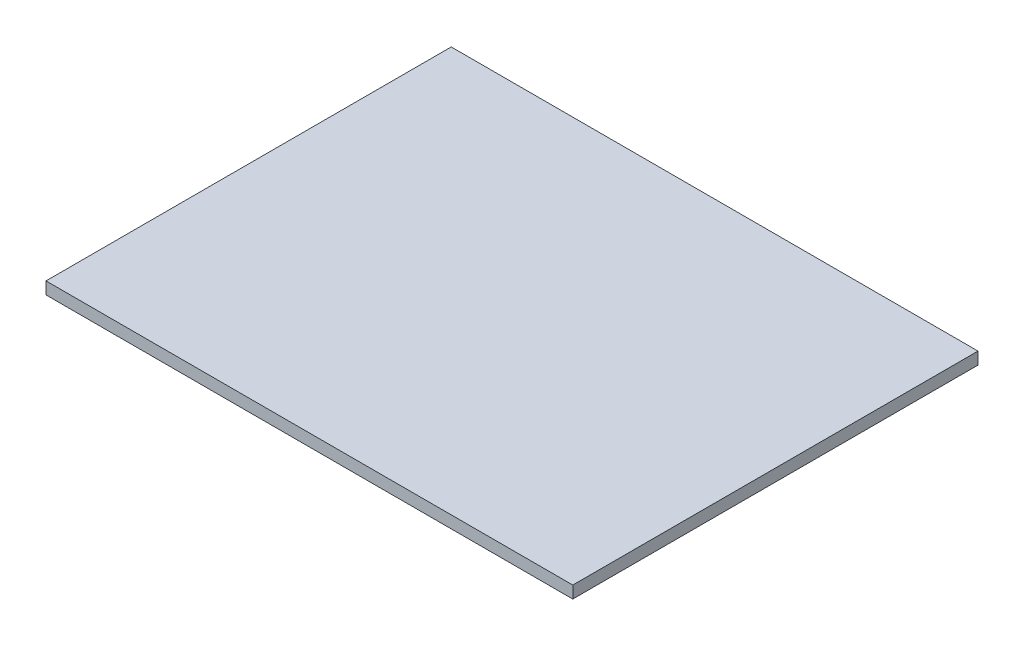
ISO-10303-21;
HEADER;
FILE_DESCRIPTION(('STEP AP214'),'2;1');
FILE_NAME('part.step','',(''),(''),'','','');
FILE_SCHEMA(('AUTOMOTIVE_DESIGN { 1 0 10303 214 1 1 1 1 }'));
ENDSEC;
DATA;
#1=APPLICATION_CONTEXT('core data for automotive mechanical design processes');
#2=APPLICATION_PROTOCOL_DEFINITION('international standard','automotive_design',2000,#1);
#3=PRODUCT_CONTEXT('',#1,'mechanical');
#4=PRODUCT('Part','Part','',(#3));
#5=PRODUCT_RELATED_PRODUCT_CATEGORY('part','',(#4));
#6=PRODUCT_DEFINITION_FORMATION('','',#4);
#7=PRODUCT_DEFINITION_CONTEXT('part definition',#1,'design');
#8=PRODUCT_DEFINITION('design','',#6,#7);
#9=PRODUCT_DEFINITION_SHAPE('','',#8);
#10=(LENGTH_UNIT() NAMED_UNIT(*) SI_UNIT(.MILLI.,.METRE.));
#11=(NAMED_UNIT(*) PLANE_ANGLE_UNIT() SI_UNIT($,.RADIAN.));
#12=(NAMED_UNIT(*) SI_UNIT($,.STERADIAN.) SOLID_ANGLE_UNIT());
#13=UNCERTAINTY_MEASURE_WITH_UNIT(LENGTH_MEASURE(1.E-05),#10,'distance_accuracy_value','');
#14=(GEOMETRIC_REPRESENTATION_CONTEXT(3) GLOBAL_UNCERTAINTY_ASSIGNED_CONTEXT((#13)) GLOBAL_UNIT_ASSIGNED_CONTEXT((#10,
#11,#12)) REPRESENTATION_CONTEXT('',''));
#15=CARTESIAN_POINT('',(0.,0.,0.));
#16=DIRECTION('',(0.,0.,1.));
#17=DIRECTION('',(1.,0.,0.));
#18=AXIS2_PLACEMENT_3D('',#15,#16,#17);
#19=CARTESIAN_POINT('',(-65.,3.,50.));
#20=DIRECTION('',(1.,0.,0.));
#21=DIRECTION('',(0.,0.,-1.));
#22=AXIS2_PLACEMENT_3D('',#19,#20,#21);
#23=PLANE('',#22);
#24=DIRECTION('',(0.,0.,1.));
#25=VECTOR('',#24,1.);
#26=CARTESIAN_POINT('',(-65.,0.,50.));
#27=LINE('',#26,#25);
#28=CARTESIAN_POINT('',(-65.,0.,-50.));
#29=VERTEX_POINT('',#28);
#30=CARTESIAN_POINT('',(-65.,0.,50.));
#31=VERTEX_POINT('',#30);
#32=EDGE_CURVE('E96',#29,#31,#27,.T.);
#33=ORIENTED_EDGE('',*,*,#32,.T.);
#34=DIRECTION('',(0.,-1.,0.));
#35=VECTOR('',#34,1.);
#36=CARTESIAN_POINT('',(-65.,3.,50.));
#37=LINE('',#36,#35);
#38=CARTESIAN_POINT('',(-65.,3.,50.));
#39=VERTEX_POINT('',#38);
#40=EDGE_CURVE('E11',#39,#31,#37,.T.);
#41=ORIENTED_EDGE('',*,*,#40,.F.);
#42=DIRECTION('',(0.,0.,1.));
#43=VECTOR('',#42,1.);
#44=CARTESIAN_POINT('',(-65.,3.,50.));
#45=LINE('',#44,#43);
#46=CARTESIAN_POINT('',(-65.,3.,-50.));
#47=VERTEX_POINT('',#46);
#48=EDGE_CURVE('E84',#47,#39,#45,.T.);
#49=ORIENTED_EDGE('',*,*,#48,.F.);
#50=DIRECTION('',(0.,-1.,0.));
#51=VECTOR('',#50,1.);
#52=CARTESIAN_POINT('',(-65.,3.,-50.));
#53=LINE('',#52,#51);
#54=EDGE_CURVE('E92',#47,#29,#53,.T.);
#55=ORIENTED_EDGE('',*,*,#54,.T.);
#56=EDGE_LOOP('',(#33,#41,#49,#55));
#57=FACE_BOUND('',#56,.T.);
#58=ADVANCED_FACE('F33',(#57),#23,.F.);
#59=CARTESIAN_POINT('',(65.,3.,50.));
#60=DIRECTION('',(0.,0.,-1.));
#61=DIRECTION('',(-1.,0.,0.));
#62=AXIS2_PLACEMENT_3D('',#59,#60,#61);
#63=PLANE('',#62);
#64=DIRECTION('',(1.,0.,0.));
#65=VECTOR('',#64,1.);
#66=CARTESIAN_POINT('',(65.,0.,50.));
#67=LINE('',#66,#65);
#68=CARTESIAN_POINT('',(65.,0.,50.));
#69=VERTEX_POINT('',#68);
#70=EDGE_CURVE('E88',#31,#69,#67,.T.);
#71=ORIENTED_EDGE('',*,*,#70,.T.);
#72=DIRECTION('',(0.,-1.,0.));
#73=VECTOR('',#72,1.);
#74=CARTESIAN_POINT('',(65.,3.,50.));
#75=LINE('',#74,#73);
#76=CARTESIAN_POINT('',(65.,3.,50.));
#77=VERTEX_POINT('',#76);
#78=EDGE_CURVE('E41',#77,#69,#75,.T.);
#79=ORIENTED_EDGE('',*,*,#78,.F.);
#80=DIRECTION('',(1.,0.,0.));
#81=VECTOR('',#80,1.);
#82=CARTESIAN_POINT('',(65.,3.,50.));
#83=LINE('',#82,#81);
#84=EDGE_CURVE('E79',#39,#77,#83,.T.);
#85=ORIENTED_EDGE('',*,*,#84,.F.);
#86=ORIENTED_EDGE('',*,*,#40,.T.);
#87=EDGE_LOOP('',(#71,#79,#85,#86));
#88=FACE_BOUND('',#87,.T.);
#89=ADVANCED_FACE('F87',(#88),#63,.F.);
#90=CARTESIAN_POINT('',(65.,3.,50.));
#91=DIRECTION('',(-1.,0.,0.));
#92=DIRECTION('',(0.,0.,1.));
#93=AXIS2_PLACEMENT_3D('',#90,#91,#92);
#94=PLANE('',#93);
#95=DIRECTION('',(0.,0.,-1.));
#96=VECTOR('',#95,1.);
#97=CARTESIAN_POINT('',(65.,0.,50.));
#98=LINE('',#97,#96);
#99=CARTESIAN_POINT('',(65.,0.,-50.));
#100=VERTEX_POINT('',#99);
#101=EDGE_CURVE('E66',#69,#100,#98,.T.);
#102=ORIENTED_EDGE('',*,*,#101,.T.);
#103=DIRECTION('',(0.,-1.,0.));
#104=VECTOR('',#103,1.);
#105=CARTESIAN_POINT('',(65.,3.,-50.));
#106=LINE('',#105,#104);
#107=CARTESIAN_POINT('',(65.,3.,-50.));
#108=VERTEX_POINT('',#107);
#109=EDGE_CURVE('E89',#108,#100,#106,.T.);
#110=ORIENTED_EDGE('',*,*,#109,.F.);
#111=DIRECTION('',(0.,0.,-1.));
#112=VECTOR('',#111,1.);
#113=CARTESIAN_POINT('',(65.,3.,50.));
#114=LINE('',#113,#112);
#115=EDGE_CURVE('E82',#77,#108,#114,.T.);
#116=ORIENTED_EDGE('',*,*,#115,.F.);
#117=ORIENTED_EDGE('',*,*,#78,.T.);
#118=EDGE_LOOP('',(#102,#110,#116,#117));
#119=FACE_BOUND('',#118,.T.);
#120=ADVANCED_FACE('F90',(#119),#94,.F.);
#121=CARTESIAN_POINT('',(65.,3.,-50.));
#122=DIRECTION('',(0.,0.,1.));
#123=DIRECTION('',(1.,0.,0.));
#124=AXIS2_PLACEMENT_3D('',#121,#122,#123);
#125=PLANE('',#124);
#126=DIRECTION('',(-1.,0.,0.));
#127=VECTOR('',#126,1.);
#128=CARTESIAN_POINT('',(65.,0.,-50.));
#129=LINE('',#128,#127);
#130=EDGE_CURVE('E72',#100,#29,#129,.T.);
#131=ORIENTED_EDGE('',*,*,#130,.T.);
#132=ORIENTED_EDGE('',*,*,#54,.F.);
#133=DIRECTION('',(-1.,0.,0.));
#134=VECTOR('',#133,1.);
#135=CARTESIAN_POINT('',(65.,3.,-50.));
#136=LINE('',#135,#134);
#137=EDGE_CURVE('E49',#108,#47,#136,.T.);
#138=ORIENTED_EDGE('',*,*,#137,.F.);
#139=ORIENTED_EDGE('',*,*,#109,.T.);
#140=EDGE_LOOP('',(#131,#132,#138,#139));
#141=FACE_BOUND('',#140,.T.);
#142=ADVANCED_FACE('F103',(#141),#125,.F.);
#143=CARTESIAN_POINT('',(0.,3.,0.));
#144=DIRECTION('',(0.,1.,0.));
#145=DIRECTION('',(0.,0.,1.));
#146=AXIS2_PLACEMENT_3D('',#143,#144,#145);
#147=PLANE('',#146);
#148=ORIENTED_EDGE('',*,*,#48,.T.);
#149=ORIENTED_EDGE('',*,*,#84,.T.);
#150=ORIENTED_EDGE('',*,*,#115,.T.);
#151=ORIENTED_EDGE('',*,*,#137,.T.);
#152=EDGE_LOOP('',(#148,#149,#150,#151));
#153=FACE_BOUND('',#152,.T.);
#154=ADVANCED_FACE('F80',(#153),#147,.T.);
#155=CARTESIAN_POINT('',(0.,0.,0.));
#156=DIRECTION('',(0.,1.,0.));
#157=DIRECTION('',(0.,0.,1.));
#158=AXIS2_PLACEMENT_3D('',#155,#156,#157);
#159=PLANE('',#158);
#160=ORIENTED_EDGE('',*,*,#32,.F.);
#161=ORIENTED_EDGE('',*,*,#130,.F.);
#162=ORIENTED_EDGE('',*,*,#101,.F.);
#163=ORIENTED_EDGE('',*,*,#70,.F.);
#164=EDGE_LOOP('',(#160,#161,#162,#163));
#165=FACE_BOUND('',#164,.T.);
#166=ADVANCED_FACE('F106',(#165),#159,.F.);
#167=CLOSED_SHELL('',(#58,#89,#120,#142,#154,#166));
#168=MANIFOLD_SOLID_BREP('B2',#167);
#169=ADVANCED_BREP_SHAPE_REPRESENTATION('',(#18,#168),#14);
#170=SHAPE_DEFINITION_REPRESENTATION(#9,#169);
ENDSEC;
END-ISO-10303-21;
